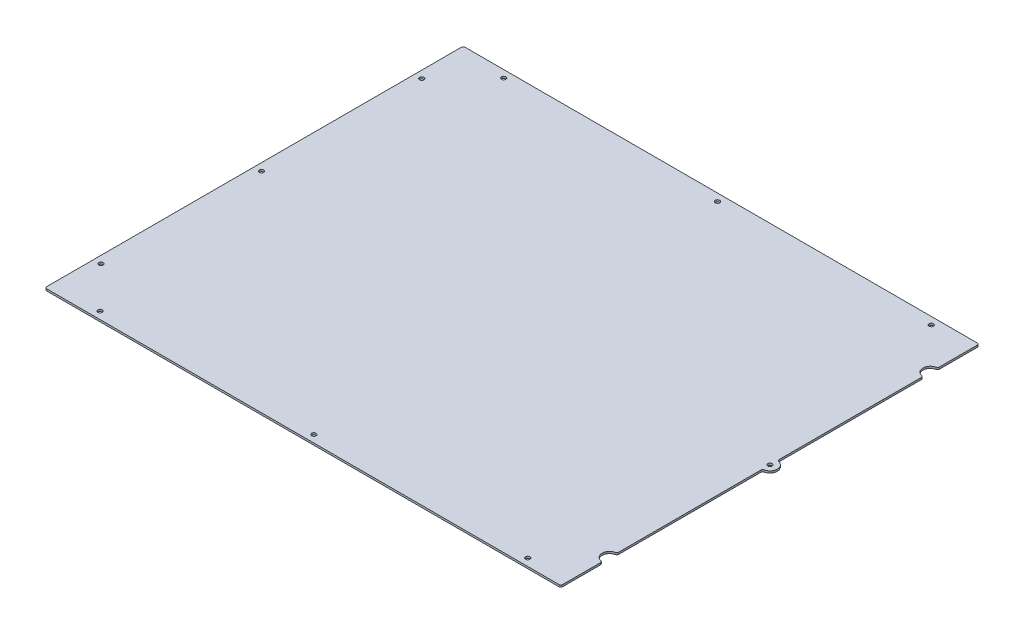
ISO-10303-21;
HEADER;
FILE_DESCRIPTION(('STEP AP214'),'2;1');
FILE_NAME('part.step','',(''),(''),'','','');
FILE_SCHEMA(('AUTOMOTIVE_DESIGN { 1 0 10303 214 1 1 1 1 }'));
ENDSEC;
DATA;
#1=APPLICATION_CONTEXT('core data for automotive mechanical design processes');
#2=APPLICATION_PROTOCOL_DEFINITION('international standard','automotive_design',2000,#1);
#3=PRODUCT_CONTEXT('',#1,'mechanical');
#4=PRODUCT('Part','Part','',(#3));
#5=PRODUCT_RELATED_PRODUCT_CATEGORY('part','',(#4));
#6=PRODUCT_DEFINITION_FORMATION('','',#4);
#7=PRODUCT_DEFINITION_CONTEXT('part definition',#1,'design');
#8=PRODUCT_DEFINITION('design','',#6,#7);
#9=PRODUCT_DEFINITION_SHAPE('','',#8);
#10=(LENGTH_UNIT() NAMED_UNIT(*) SI_UNIT(.MILLI.,.METRE.));
#11=(NAMED_UNIT(*) PLANE_ANGLE_UNIT() SI_UNIT($,.RADIAN.));
#12=(NAMED_UNIT(*) SI_UNIT($,.STERADIAN.) SOLID_ANGLE_UNIT());
#13=UNCERTAINTY_MEASURE_WITH_UNIT(LENGTH_MEASURE(1.E-05),#10,'distance_accuracy_value','');
#14=(GEOMETRIC_REPRESENTATION_CONTEXT(3) GLOBAL_UNCERTAINTY_ASSIGNED_CONTEXT((#13)) GLOBAL_UNIT_ASSIGNED_CONTEXT((#10,
#11,#12)) REPRESENTATION_CONTEXT('',''));
#15=CARTESIAN_POINT('',(0.,0.,0.));
#16=DIRECTION('',(0.,0.,1.));
#17=DIRECTION('',(1.,0.,0.));
#18=AXIS2_PLACEMENT_3D('',#15,#16,#17);
#19=CARTESIAN_POINT('',(-341.884,2.54,273.304));
#20=DIRECTION('',(1.,0.,0.));
#21=DIRECTION('',(0.,0.,-1.));
#22=AXIS2_PLACEMENT_3D('',#19,#20,#21);
#23=PLANE('',#22);
#24=DIRECTION('',(0.,0.,1.));
#25=VECTOR('',#24,1.);
#26=CARTESIAN_POINT('',(-341.884,2.54,273.304));
#27=LINE('',#26,#25);
#28=CARTESIAN_POINT('',(-341.884,2.54,-270.764));
#29=VERTEX_POINT('',#28);
#30=CARTESIAN_POINT('',(-341.884,2.54,270.764));
#31=VERTEX_POINT('',#30);
#32=EDGE_CURVE('E192',#29,#31,#27,.T.);
#33=ORIENTED_EDGE('',*,*,#32,.F.);
#34=DIRECTION('',(0.,-1.,0.));
#35=VECTOR('',#34,1.);
#36=CARTESIAN_POINT('',(-341.884,2.54,-270.764));
#37=LINE('',#36,#35);
#38=CARTESIAN_POINT('',(-341.884,0.,-270.764));
#39=VERTEX_POINT('',#38);
#40=EDGE_CURVE('E177',#29,#39,#37,.T.);
#41=ORIENTED_EDGE('',*,*,#40,.T.);
#42=DIRECTION('',(0.,0.,1.));
#43=VECTOR('',#42,1.);
#44=CARTESIAN_POINT('',(-341.884,0.,273.304));
#45=LINE('',#44,#43);
#46=CARTESIAN_POINT('',(-341.884,0.,270.764));
#47=VERTEX_POINT('',#46);
#48=EDGE_CURVE('E189',#39,#47,#45,.T.);
#49=ORIENTED_EDGE('',*,*,#48,.T.);
#50=DIRECTION('',(0.,-1.,0.));
#51=VECTOR('',#50,1.);
#52=CARTESIAN_POINT('',(-341.884,2.54,270.764));
#53=LINE('',#52,#51);
#54=EDGE_CURVE('E194',#47,#31,#53,.F.);
#55=ORIENTED_EDGE('',*,*,#54,.T.);
#56=EDGE_LOOP('',(#33,#41,#49,#55));
#57=FACE_BOUND('',#56,.T.);
#58=ADVANCED_FACE('F35',(#57),#23,.F.);
#59=CARTESIAN_POINT('',(-341.884,2.54,273.304));
#60=DIRECTION('',(0.,0.,-1.));
#61=DIRECTION('',(-1.,0.,0.));
#62=AXIS2_PLACEMENT_3D('',#59,#60,#61);
#63=PLANE('',#62);
#64=DIRECTION('',(1.,0.,0.));
#65=VECTOR('',#64,1.);
#66=CARTESIAN_POINT('',(-341.884,2.54,273.304));
#67=LINE('',#66,#65);
#68=CARTESIAN_POINT('',(-339.344,2.54,273.304));
#69=VERTEX_POINT('',#68);
#70=CARTESIAN_POINT('',(329.692,2.54,273.304));
#71=VERTEX_POINT('',#70);
#72=EDGE_CURVE('E409',#69,#71,#67,.T.);
#73=ORIENTED_EDGE('',*,*,#72,.F.);
#74=DIRECTION('',(0.,-1.,0.));
#75=VECTOR('',#74,1.);
#76=CARTESIAN_POINT('',(-339.344,2.54,273.304));
#77=LINE('',#76,#75);
#78=CARTESIAN_POINT('',(-339.344,0.,273.304));
#79=VERTEX_POINT('',#78);
#80=EDGE_CURVE('E265',#69,#79,#77,.T.);
#81=ORIENTED_EDGE('',*,*,#80,.T.);
#82=DIRECTION('',(1.,0.,0.));
#83=VECTOR('',#82,1.);
#84=CARTESIAN_POINT('',(-341.884,0.,273.304));
#85=LINE('',#84,#83);
#86=CARTESIAN_POINT('',(329.692,0.,273.304));
#87=VERTEX_POINT('',#86);
#88=EDGE_CURVE('E198',#79,#87,#85,.T.);
#89=ORIENTED_EDGE('',*,*,#88,.T.);
#90=DIRECTION('',(0.,-1.,0.));
#91=VECTOR('',#90,1.);
#92=CARTESIAN_POINT('',(329.692,2.54,273.304));
#93=LINE('',#92,#91);
#94=EDGE_CURVE('E263',#87,#71,#93,.F.);
#95=ORIENTED_EDGE('',*,*,#94,.T.);
#96=EDGE_LOOP('',(#73,#81,#89,#95));
#97=FACE_BOUND('',#96,.T.);
#98=ADVANCED_FACE('F362',(#97),#63,.F.);
#99=CARTESIAN_POINT('',(332.232,2.54,219.202));
#100=DIRECTION('',(-1.,0.,0.));
#101=DIRECTION('',(0.,0.,1.));
#102=AXIS2_PLACEMENT_3D('',#99,#100,#101);
#103=PLANE('',#102);
#104=DIRECTION('',(0.,0.,-1.));
#105=VECTOR('',#104,1.);
#106=CARTESIAN_POINT('',(332.232,2.54,219.202));
#107=LINE('',#106,#105);
#108=CARTESIAN_POINT('',(332.232,2.54,270.764));
#109=VERTEX_POINT('',#108);
#110=CARTESIAN_POINT('',(332.232,2.54,221.474481707814));
#111=VERTEX_POINT('',#110);
#112=EDGE_CURVE('E404',#109,#111,#107,.T.);
#113=ORIENTED_EDGE('',*,*,#112,.F.);
#114=DIRECTION('',(0.,-1.,0.));
#115=VECTOR('',#114,1.);
#116=CARTESIAN_POINT('',(332.232,2.54,270.764));
#117=LINE('',#116,#115);
#118=CARTESIAN_POINT('',(332.232,0.,270.764));
#119=VERTEX_POINT('',#118);
#120=EDGE_CURVE('E270',#109,#119,#117,.T.);
#121=ORIENTED_EDGE('',*,*,#120,.T.);
#122=DIRECTION('',(0.,0.,-1.));
#123=VECTOR('',#122,1.);
#124=CARTESIAN_POINT('',(332.232,0.,219.202));
#125=LINE('',#124,#123);
#126=CARTESIAN_POINT('',(332.232,0.,221.474481707814));
#127=VERTEX_POINT('',#126);
#128=EDGE_CURVE('E202',#119,#127,#125,.T.);
#129=ORIENTED_EDGE('',*,*,#128,.T.);
#130=DIRECTION('',(0.,-1.,0.));
#131=VECTOR('',#130,1.);
#132=CARTESIAN_POINT('',(332.232,2.54,221.474481707814));
#133=LINE('',#132,#131);
#134=EDGE_CURVE('E268',#127,#111,#133,.F.);
#135=ORIENTED_EDGE('',*,*,#134,.T.);
#136=EDGE_LOOP('',(#113,#121,#129,#135));
#137=FACE_BOUND('',#136,.T.);
#138=ADVANCED_FACE('F367',(#137),#103,.F.);
#139=CARTESIAN_POINT('',(332.232,2.54,209.55));
#140=DIRECTION('',(0.,-1.,0.));
#141=DIRECTION('',(0.,0.,-1.));
#142=AXIS2_PLACEMENT_3D('',#139,#140,#141);
#143=CYLINDRICAL_SURFACE('',#142,9.65199999999997);
#144=CARTESIAN_POINT('',(332.232,2.54,209.55));
#145=DIRECTION('',(0.,-1.,0.));
#146=DIRECTION('',(0.,0.,1.));
#147=AXIS2_PLACEMENT_3D('',#144,#145,#146);
#148=CIRCLE('',#147,9.65199999999997);
#149=CARTESIAN_POINT('',(330.221166666667,2.54,218.990214685353));
#150=VERTEX_POINT('',#149);
#151=CARTESIAN_POINT('',(330.221166666667,2.54,200.109785314647));
#152=VERTEX_POINT('',#151);
#153=EDGE_CURVE('E403',#150,#152,#148,.T.);
#154=ORIENTED_EDGE('',*,*,#153,.F.);
#155=DIRECTION('',(0.,-1.,0.));
#156=VECTOR('',#155,1.);
#157=CARTESIAN_POINT('',(330.221166666667,2.54,218.990214685353));
#158=LINE('',#157,#156);
#159=CARTESIAN_POINT('',(330.221166666667,0.,218.990214685353));
#160=VERTEX_POINT('',#159);
#161=EDGE_CURVE('E275',#150,#160,#158,.T.);
#162=ORIENTED_EDGE('',*,*,#161,.T.);
#163=CARTESIAN_POINT('',(332.232,0.,209.55));
#164=DIRECTION('',(0.,-1.,0.));
#165=DIRECTION('',(0.,0.,1.));
#166=AXIS2_PLACEMENT_3D('',#163,#164,#165);
#167=CIRCLE('',#166,9.65199999999997);
#168=CARTESIAN_POINT('',(330.221166666667,0.,200.109785314647));
#169=VERTEX_POINT('',#168);
#170=EDGE_CURVE('E213',#160,#169,#167,.T.);
#171=ORIENTED_EDGE('',*,*,#170,.T.);
#172=DIRECTION('',(0.,-1.,0.));
#173=VECTOR('',#172,1.);
#174=CARTESIAN_POINT('',(330.221166666667,2.54,200.109785314647));
#175=LINE('',#174,#173);
#176=EDGE_CURVE('E273',#169,#152,#175,.F.);
#177=ORIENTED_EDGE('',*,*,#176,.T.);
#178=EDGE_LOOP('',(#154,#162,#171,#177));
#179=FACE_BOUND('',#178,.T.);
#180=ADVANCED_FACE('F519',(#179),#143,.F.);
#181=CARTESIAN_POINT('',(332.232,2.54,9.65199999999998));
#182=DIRECTION('',(-1.,0.,0.));
#183=DIRECTION('',(0.,0.,1.));
#184=AXIS2_PLACEMENT_3D('',#181,#182,#183);
#185=PLANE('',#184);
#186=DIRECTION('',(0.,0.,-1.));
#187=VECTOR('',#186,1.);
#188=CARTESIAN_POINT('',(332.232,2.54,9.65199999999998));
#189=LINE('',#188,#187);
#190=CARTESIAN_POINT('',(332.232,2.54,197.625518292186));
#191=VERTEX_POINT('',#190);
#192=CARTESIAN_POINT('',(332.232,2.54,11.9244817078144));
#193=VERTEX_POINT('',#192);
#194=EDGE_CURVE('E331',#191,#193,#189,.T.);
#195=ORIENTED_EDGE('',*,*,#194,.F.);
#196=DIRECTION('',(0.,-1.,0.));
#197=VECTOR('',#196,1.);
#198=CARTESIAN_POINT('',(332.232,2.54,197.625518292186));
#199=LINE('',#198,#197);
#200=CARTESIAN_POINT('',(332.232,0.,197.625518292186));
#201=VERTEX_POINT('',#200);
#202=EDGE_CURVE('E280',#191,#201,#199,.T.);
#203=ORIENTED_EDGE('',*,*,#202,.T.);
#204=DIRECTION('',(0.,0.,-1.));
#205=VECTOR('',#204,1.);
#206=CARTESIAN_POINT('',(332.232,0.,9.65199999999998));
#207=LINE('',#206,#205);
#208=CARTESIAN_POINT('',(332.232,0.,11.9244817078144));
#209=VERTEX_POINT('',#208);
#210=EDGE_CURVE('E216',#201,#209,#207,.T.);
#211=ORIENTED_EDGE('',*,*,#210,.T.);
#212=DIRECTION('',(0.,1.,0.));
#213=VECTOR('',#212,1.);
#214=CARTESIAN_POINT('',(332.232,2.54,11.9244817078144));
#215=LINE('',#214,#213);
#216=EDGE_CURVE('E278',#209,#193,#215,.T.);
#217=ORIENTED_EDGE('',*,*,#216,.T.);
#218=EDGE_LOOP('',(#195,#203,#211,#217));
#219=FACE_BOUND('',#218,.T.);
#220=ADVANCED_FACE('F516',(#219),#185,.F.);
#221=CARTESIAN_POINT('',(332.232,2.54,0.));
#222=DIRECTION('',(0.,-1.,0.));
#223=DIRECTION('',(0.,0.,-1.));
#224=AXIS2_PLACEMENT_3D('',#221,#222,#223);
#225=CYLINDRICAL_SURFACE('',#224,9.65199999999998);
#226=CARTESIAN_POINT('',(332.232,2.54,0.));
#227=DIRECTION('',(0.,1.,0.));
#228=DIRECTION('',(0.,0.,1.));
#229=AXIS2_PLACEMENT_3D('',#226,#227,#228);
#230=CIRCLE('',#229,9.65199999999998);
#231=CARTESIAN_POINT('',(334.242833333333,2.54,9.44021468535305));
#232=VERTEX_POINT('',#231);
#233=CARTESIAN_POINT('',(334.242833333333,2.54,-9.44021468535305));
#234=VERTEX_POINT('',#233);
#235=EDGE_CURVE('E323',#232,#234,#230,.T.);
#236=ORIENTED_EDGE('',*,*,#235,.F.);
#237=DIRECTION('',(0.,-1.,0.));
#238=VECTOR('',#237,1.);
#239=CARTESIAN_POINT('',(334.242833333333,2.54,9.44021468535305));
#240=LINE('',#239,#238);
#241=CARTESIAN_POINT('',(334.242833333333,0.,9.44021468535305));
#242=VERTEX_POINT('',#241);
#243=EDGE_CURVE('E285',#232,#242,#240,.T.);
#244=ORIENTED_EDGE('',*,*,#243,.T.);
#245=CARTESIAN_POINT('',(332.232,0.,0.));
#246=DIRECTION('',(0.,1.,0.));
#247=DIRECTION('',(0.,0.,1.));
#248=AXIS2_PLACEMENT_3D('',#245,#246,#247);
#249=CIRCLE('',#248,9.65199999999998);
#250=CARTESIAN_POINT('',(334.242833333333,0.,-9.44021468535305));
#251=VERTEX_POINT('',#250);
#252=EDGE_CURVE('E219',#242,#251,#249,.T.);
#253=ORIENTED_EDGE('',*,*,#252,.T.);
#254=DIRECTION('',(0.,-1.,0.));
#255=VECTOR('',#254,1.);
#256=CARTESIAN_POINT('',(334.242833333333,2.54,-9.44021468535305));
#257=LINE('',#256,#255);
#258=EDGE_CURVE('E283',#251,#234,#257,.F.);
#259=ORIENTED_EDGE('',*,*,#258,.T.);
#260=EDGE_LOOP('',(#236,#244,#253,#259));
#261=FACE_BOUND('',#260,.T.);
#262=ADVANCED_FACE('F312',(#261),#225,.T.);
#263=CARTESIAN_POINT('',(332.232,2.54,-199.898));
#264=DIRECTION('',(-1.,0.,0.));
#265=DIRECTION('',(0.,0.,1.));
#266=AXIS2_PLACEMENT_3D('',#263,#264,#265);
#267=PLANE('',#266);
#268=DIRECTION('',(0.,0.,-1.));
#269=VECTOR('',#268,1.);
#270=CARTESIAN_POINT('',(332.232,2.54,-199.898));
#271=LINE('',#270,#269);
#272=CARTESIAN_POINT('',(332.232,2.54,-11.9244817078144));
#273=VERTEX_POINT('',#272);
#274=CARTESIAN_POINT('',(332.232,2.54,-197.625518292186));
#275=VERTEX_POINT('',#274);
#276=EDGE_CURVE('E321',#273,#275,#271,.T.);
#277=ORIENTED_EDGE('',*,*,#276,.F.);
#278=DIRECTION('',(0.,1.,0.));
#279=VECTOR('',#278,1.);
#280=CARTESIAN_POINT('',(332.232,0.,-11.9244817078144));
#281=LINE('',#280,#279);
#282=CARTESIAN_POINT('',(332.232,0.,-11.9244817078144));
#283=VERTEX_POINT('',#282);
#284=EDGE_CURVE('E290',#273,#283,#281,.F.);
#285=ORIENTED_EDGE('',*,*,#284,.T.);
#286=DIRECTION('',(0.,0.,-1.));
#287=VECTOR('',#286,1.);
#288=CARTESIAN_POINT('',(332.232,0.,-199.898));
#289=LINE('',#288,#287);
#290=CARTESIAN_POINT('',(332.232,0.,-197.625518292186));
#291=VERTEX_POINT('',#290);
#292=EDGE_CURVE('E222',#283,#291,#289,.T.);
#293=ORIENTED_EDGE('',*,*,#292,.T.);
#294=DIRECTION('',(0.,-1.,0.));
#295=VECTOR('',#294,1.);
#296=CARTESIAN_POINT('',(332.232,2.54,-197.625518292186));
#297=LINE('',#296,#295);
#298=EDGE_CURVE('E288',#291,#275,#297,.F.);
#299=ORIENTED_EDGE('',*,*,#298,.T.);
#300=EDGE_LOOP('',(#277,#285,#293,#299));
#301=FACE_BOUND('',#300,.T.);
#302=ADVANCED_FACE('F325',(#301),#267,.F.);
#303=CARTESIAN_POINT('',(332.232,2.54,-209.55));
#304=DIRECTION('',(0.,-1.,0.));
#305=DIRECTION('',(0.,0.,-1.));
#306=AXIS2_PLACEMENT_3D('',#303,#304,#305);
#307=CYLINDRICAL_SURFACE('',#306,9.65199999999997);
#308=CARTESIAN_POINT('',(332.232,2.54,-209.55));
#309=DIRECTION('',(0.,-1.,0.));
#310=DIRECTION('',(0.,0.,1.));
#311=AXIS2_PLACEMENT_3D('',#308,#309,#310);
#312=CIRCLE('',#311,9.65199999999997);
#313=CARTESIAN_POINT('',(330.221166666667,2.54,-200.109785314647));
#314=VERTEX_POINT('',#313);
#315=CARTESIAN_POINT('',(330.221166666667,2.54,-218.990214685353));
#316=VERTEX_POINT('',#315);
#317=EDGE_CURVE('E327',#314,#316,#312,.T.);
#318=ORIENTED_EDGE('',*,*,#317,.F.);
#319=DIRECTION('',(0.,-1.,0.));
#320=VECTOR('',#319,1.);
#321=CARTESIAN_POINT('',(330.221166666667,2.54,-200.109785314647));
#322=LINE('',#321,#320);
#323=CARTESIAN_POINT('',(330.221166666667,0.,-200.109785314647));
#324=VERTEX_POINT('',#323);
#325=EDGE_CURVE('E295',#314,#324,#322,.T.);
#326=ORIENTED_EDGE('',*,*,#325,.T.);
#327=CARTESIAN_POINT('',(332.232,0.,-209.55));
#328=DIRECTION('',(0.,-1.,0.));
#329=DIRECTION('',(0.,0.,1.));
#330=AXIS2_PLACEMENT_3D('',#327,#328,#329);
#331=CIRCLE('',#330,9.65199999999997);
#332=CARTESIAN_POINT('',(330.221166666667,0.,-218.990214685353));
#333=VERTEX_POINT('',#332);
#334=EDGE_CURVE('E225',#324,#333,#331,.T.);
#335=ORIENTED_EDGE('',*,*,#334,.T.);
#336=DIRECTION('',(0.,-1.,0.));
#337=VECTOR('',#336,1.);
#338=CARTESIAN_POINT('',(330.221166666667,2.54,-218.990214685353));
#339=LINE('',#338,#337);
#340=EDGE_CURVE('E293',#333,#316,#339,.F.);
#341=ORIENTED_EDGE('',*,*,#340,.T.);
#342=EDGE_LOOP('',(#318,#326,#335,#341));
#343=FACE_BOUND('',#342,.T.);
#344=ADVANCED_FACE('F349',(#343),#307,.F.);
#345=CARTESIAN_POINT('',(332.232,2.54,-273.304));
#346=DIRECTION('',(-1.,0.,0.));
#347=DIRECTION('',(0.,0.,1.));
#348=AXIS2_PLACEMENT_3D('',#345,#346,#347);
#349=PLANE('',#348);
#350=DIRECTION('',(0.,0.,-1.));
#351=VECTOR('',#350,1.);
#352=CARTESIAN_POINT('',(332.232,2.54,-273.304));
#353=LINE('',#352,#351);
#354=CARTESIAN_POINT('',(332.232,2.54,-221.474481707814));
#355=VERTEX_POINT('',#354);
#356=CARTESIAN_POINT('',(332.232,2.54,-270.764));
#357=VERTEX_POINT('',#356);
#358=EDGE_CURVE('E329',#355,#357,#353,.T.);
#359=ORIENTED_EDGE('',*,*,#358,.F.);
#360=DIRECTION('',(0.,-1.,0.));
#361=VECTOR('',#360,1.);
#362=CARTESIAN_POINT('',(332.232,2.54,-221.474481707814));
#363=LINE('',#362,#361);
#364=CARTESIAN_POINT('',(332.232,0.,-221.474481707814));
#365=VERTEX_POINT('',#364);
#366=EDGE_CURVE('E299',#355,#365,#363,.T.);
#367=ORIENTED_EDGE('',*,*,#366,.T.);
#368=DIRECTION('',(0.,0.,-1.));
#369=VECTOR('',#368,1.);
#370=CARTESIAN_POINT('',(332.232,0.,-273.304));
#371=LINE('',#370,#369);
#372=CARTESIAN_POINT('',(332.232,0.,-270.764));
#373=VERTEX_POINT('',#372);
#374=EDGE_CURVE('E228',#365,#373,#371,.T.);
#375=ORIENTED_EDGE('',*,*,#374,.T.);
#376=DIRECTION('',(0.,-1.,0.));
#377=VECTOR('',#376,1.);
#378=CARTESIAN_POINT('',(332.232,2.54,-270.764));
#379=LINE('',#378,#377);
#380=EDGE_CURVE('E50',#373,#357,#379,.F.);
#381=ORIENTED_EDGE('',*,*,#380,.T.);
#382=EDGE_LOOP('',(#359,#367,#375,#381));
#383=FACE_BOUND('',#382,.T.);
#384=ADVANCED_FACE('F341',(#383),#349,.F.);
#385=CARTESIAN_POINT('',(-341.884,2.54,-273.304));
#386=DIRECTION('',(0.,0.,1.));
#387=DIRECTION('',(1.,0.,0.));
#388=AXIS2_PLACEMENT_3D('',#385,#386,#387);
#389=PLANE('',#388);
#390=DIRECTION('',(-1.,0.,0.));
#391=VECTOR('',#390,1.);
#392=CARTESIAN_POINT('',(-341.884,0.,-273.304));
#393=LINE('',#392,#391);
#394=CARTESIAN_POINT('',(329.692,0.,-273.304));
#395=VERTEX_POINT('',#394);
#396=CARTESIAN_POINT('',(-339.344,0.,-273.304));
#397=VERTEX_POINT('',#396);
#398=EDGE_CURVE('E230',#395,#397,#393,.T.);
#399=ORIENTED_EDGE('',*,*,#398,.T.);
#400=DIRECTION('',(0.,-1.,0.));
#401=VECTOR('',#400,1.);
#402=CARTESIAN_POINT('',(-339.344,2.54,-273.304));
#403=LINE('',#402,#401);
#404=CARTESIAN_POINT('',(-339.344,2.54,-273.304));
#405=VERTEX_POINT('',#404);
#406=EDGE_CURVE('E178',#397,#405,#403,.F.);
#407=ORIENTED_EDGE('',*,*,#406,.T.);
#408=DIRECTION('',(-1.,0.,0.));
#409=VECTOR('',#408,1.);
#410=CARTESIAN_POINT('',(-341.884,2.54,-273.304));
#411=LINE('',#410,#409);
#412=CARTESIAN_POINT('',(329.692,2.54,-273.304));
#413=VERTEX_POINT('',#412);
#414=EDGE_CURVE('E208',#413,#405,#411,.T.);
#415=ORIENTED_EDGE('',*,*,#414,.F.);
#416=DIRECTION('',(0.,-1.,0.));
#417=VECTOR('',#416,1.);
#418=CARTESIAN_POINT('',(329.692,2.54,-273.304));
#419=LINE('',#418,#417);
#420=EDGE_CURVE('E183',#413,#395,#419,.T.);
#421=ORIENTED_EDGE('',*,*,#420,.T.);
#422=EDGE_LOOP('',(#399,#407,#415,#421));
#423=FACE_BOUND('',#422,.T.);
#424=ADVANCED_FACE('F338',(#423),#389,.F.);
#425=CARTESIAN_POINT('',(332.232,2.54,-209.55));
#426=DIRECTION('',(0.,1.,0.));
#427=DIRECTION('',(0.,0.,1.));
#428=AXIS2_PLACEMENT_3D('',#425,#426,#427);
#429=PLANE('',#428);
#430=CARTESIAN_POINT('',(-279.4,2.54,-263.652));
#431=DIRECTION('',(0.,1.,0.));
#432=DIRECTION('',(0.,0.,1.));
#433=AXIS2_PLACEMENT_3D('',#430,#431,#432);
#434=CIRCLE('',#433,2.8956);
#435=CARTESIAN_POINT('',(-279.4,2.54,-260.7564));
#436=VERTEX_POINT('',#435);
#437=EDGE_CURVE('E466',#436,#436,#434,.T.);
#438=ORIENTED_EDGE('',*,*,#437,.F.);
#439=EDGE_LOOP('',(#438));
#440=FACE_BOUND('',#439,.T.);
#441=CARTESIAN_POINT('',(-332.232,2.54,-209.55));
#442=DIRECTION('',(0.,1.,0.));
#443=DIRECTION('',(0.,0.,1.));
#444=AXIS2_PLACEMENT_3D('',#441,#442,#443);
#445=CIRCLE('',#444,2.8956);
#446=CARTESIAN_POINT('',(-332.232,2.54,-206.6544));
#447=VERTEX_POINT('',#446);
#448=EDGE_CURVE('E460',#447,#447,#445,.T.);
#449=ORIENTED_EDGE('',*,*,#448,.F.);
#450=EDGE_LOOP('',(#449));
#451=FACE_BOUND('',#450,.T.);
#452=CARTESIAN_POINT('',(3.88578058618805E-13,2.54,-263.652));
#453=DIRECTION('',(0.,1.,0.));
#454=DIRECTION('',(0.,0.,1.));
#455=AXIS2_PLACEMENT_3D('',#452,#453,#454);
#456=CIRCLE('',#455,2.89559999999999);
#457=CARTESIAN_POINT('',(3.88578058618805E-13,2.54,-260.7564));
#458=VERTEX_POINT('',#457);
#459=EDGE_CURVE('E454',#458,#458,#456,.T.);
#460=ORIENTED_EDGE('',*,*,#459,.F.);
#461=EDGE_LOOP('',(#460));
#462=FACE_BOUND('',#461,.T.);
#463=CARTESIAN_POINT('',(279.4,2.54,-263.652));
#464=DIRECTION('',(0.,1.,0.));
#465=DIRECTION('',(0.,0.,1.));
#466=AXIS2_PLACEMENT_3D('',#463,#464,#465);
#467=CIRCLE('',#466,2.8956);
#468=CARTESIAN_POINT('',(279.4,2.54,-260.7564));
#469=VERTEX_POINT('',#468);
#470=EDGE_CURVE('E448',#469,#469,#467,.T.);
#471=ORIENTED_EDGE('',*,*,#470,.F.);
#472=EDGE_LOOP('',(#471));
#473=FACE_BOUND('',#472,.T.);
#474=CARTESIAN_POINT('',(279.400000000001,2.54,263.652));
#475=DIRECTION('',(0.,1.,0.));
#476=DIRECTION('',(0.,0.,1.));
#477=AXIS2_PLACEMENT_3D('',#474,#475,#476);
#478=CIRCLE('',#477,2.8956);
#479=CARTESIAN_POINT('',(279.400000000001,2.54,266.5476));
#480=VERTEX_POINT('',#479);
#481=EDGE_CURVE('E442',#480,#480,#478,.T.);
#482=ORIENTED_EDGE('',*,*,#481,.F.);
#483=EDGE_LOOP('',(#482));
#484=FACE_BOUND('',#483,.T.);
#485=CARTESIAN_POINT('',(6.10622663543836E-13,2.54,263.652));
#486=DIRECTION('',(0.,1.,0.));
#487=DIRECTION('',(0.,0.,1.));
#488=AXIS2_PLACEMENT_3D('',#485,#486,#487);
#489=CIRCLE('',#488,2.89559999999999);
#490=CARTESIAN_POINT('',(6.10622663543836E-13,2.54,266.5476));
#491=VERTEX_POINT('',#490);
#492=EDGE_CURVE('E436',#491,#491,#489,.T.);
#493=ORIENTED_EDGE('',*,*,#492,.F.);
#494=EDGE_LOOP('',(#493));
#495=FACE_BOUND('',#494,.T.);
#496=CARTESIAN_POINT('',(-279.399999999999,2.54,263.652));
#497=DIRECTION('',(0.,1.,0.));
#498=DIRECTION('',(0.,0.,1.));
#499=AXIS2_PLACEMENT_3D('',#496,#497,#498);
#500=CIRCLE('',#499,2.8956);
#501=CARTESIAN_POINT('',(-279.399999999999,2.54,266.5476));
#502=VERTEX_POINT('',#501);
#503=EDGE_CURVE('E430',#502,#502,#500,.T.);
#504=ORIENTED_EDGE('',*,*,#503,.F.);
#505=EDGE_LOOP('',(#504));
#506=FACE_BOUND('',#505,.T.);
#507=CARTESIAN_POINT('',(-332.232,2.54,209.55));
#508=DIRECTION('',(0.,1.,0.));
#509=DIRECTION('',(0.,0.,1.));
#510=AXIS2_PLACEMENT_3D('',#507,#508,#509);
#511=CIRCLE('',#510,2.8956);
#512=CARTESIAN_POINT('',(-332.232,2.54,212.4456));
#513=VERTEX_POINT('',#512);
#514=EDGE_CURVE('E424',#513,#513,#511,.T.);
#515=ORIENTED_EDGE('',*,*,#514,.F.);
#516=EDGE_LOOP('',(#515));
#517=FACE_BOUND('',#516,.T.);
#518=CARTESIAN_POINT('',(-332.232,2.54,-3.33066907387547E-13));
#519=DIRECTION('',(0.,1.,0.));
#520=DIRECTION('',(0.,0.,1.));
#521=AXIS2_PLACEMENT_3D('',#518,#519,#520);
#522=CIRCLE('',#521,2.8956);
#523=CARTESIAN_POINT('',(-332.232,2.54,2.89559999999967));
#524=VERTEX_POINT('',#523);
#525=EDGE_CURVE('E418',#524,#524,#522,.T.);
#526=ORIENTED_EDGE('',*,*,#525,.F.);
#527=EDGE_LOOP('',(#526));
#528=FACE_BOUND('',#527,.T.);
#529=CARTESIAN_POINT('',(332.232,2.54,0.));
#530=DIRECTION('',(0.,1.,0.));
#531=DIRECTION('',(0.,0.,1.));
#532=AXIS2_PLACEMENT_3D('',#529,#530,#531);
#533=CIRCLE('',#532,2.8956);
#534=CARTESIAN_POINT('',(332.232,2.54,2.8956));
#535=VERTEX_POINT('',#534);
#536=EDGE_CURVE('E205',#535,#535,#533,.T.);
#537=ORIENTED_EDGE('',*,*,#536,.F.);
#538=EDGE_LOOP('',(#537));
#539=FACE_BOUND('',#538,.T.);
#540=ORIENTED_EDGE('',*,*,#414,.T.);
#541=CARTESIAN_POINT('',(-339.344,2.54,-270.764));
#542=DIRECTION('',(0.,1.,0.));
#543=DIRECTION('',(0.,0.,1.));
#544=AXIS2_PLACEMENT_3D('',#541,#542,#543);
#545=CIRCLE('',#544,2.54);
#546=EDGE_CURVE('E261',#405,#29,#545,.T.);
#547=ORIENTED_EDGE('',*,*,#546,.T.);
#548=ORIENTED_EDGE('',*,*,#32,.T.);
#549=CARTESIAN_POINT('',(-339.344,2.54,270.764));
#550=DIRECTION('',(0.,1.,0.));
#551=DIRECTION('',(0.,0.,1.));
#552=AXIS2_PLACEMENT_3D('',#549,#550,#551);
#553=CIRCLE('',#552,2.54);
#554=EDGE_CURVE('E259',#31,#69,#553,.T.);
#555=ORIENTED_EDGE('',*,*,#554,.T.);
#556=ORIENTED_EDGE('',*,*,#72,.T.);
#557=CARTESIAN_POINT('',(329.692,2.54,270.764));
#558=DIRECTION('',(0.,1.,0.));
#559=DIRECTION('',(0.,0.,1.));
#560=AXIS2_PLACEMENT_3D('',#557,#558,#559);
#561=CIRCLE('',#560,2.54);
#562=EDGE_CURVE('E257',#71,#109,#561,.T.);
#563=ORIENTED_EDGE('',*,*,#562,.T.);
#564=ORIENTED_EDGE('',*,*,#112,.T.);
#565=CARTESIAN_POINT('',(329.692,2.54,221.474481707814));
#566=DIRECTION('',(0.,1.,0.));
#567=DIRECTION('',(0.,0.,1.));
#568=AXIS2_PLACEMENT_3D('',#565,#566,#567);
#569=CIRCLE('',#568,2.54);
#570=EDGE_CURVE('E255',#111,#150,#569,.T.);
#571=ORIENTED_EDGE('',*,*,#570,.T.);
#572=ORIENTED_EDGE('',*,*,#153,.T.);
#573=CARTESIAN_POINT('',(329.692,2.54,197.625518292186));
#574=DIRECTION('',(0.,1.,0.));
#575=DIRECTION('',(0.,0.,1.));
#576=AXIS2_PLACEMENT_3D('',#573,#574,#575);
#577=CIRCLE('',#576,2.54);
#578=EDGE_CURVE('E253',#152,#191,#577,.T.);
#579=ORIENTED_EDGE('',*,*,#578,.T.);
#580=ORIENTED_EDGE('',*,*,#194,.T.);
#581=CARTESIAN_POINT('',(334.772,2.54,11.9244817078144));
#582=DIRECTION('',(0.,1.,0.));
#583=DIRECTION('',(0.,0.,1.));
#584=AXIS2_PLACEMENT_3D('',#581,#582,#583);
#585=CIRCLE('',#584,2.54);
#586=EDGE_CURVE('E304',#193,#232,#585,.F.);
#587=ORIENTED_EDGE('',*,*,#586,.T.);
#588=ORIENTED_EDGE('',*,*,#235,.T.);
#589=CARTESIAN_POINT('',(334.772,2.54,-11.9244817078144));
#590=DIRECTION('',(0.,1.,0.));
#591=DIRECTION('',(0.,0.,1.));
#592=AXIS2_PLACEMENT_3D('',#589,#590,#591);
#593=CIRCLE('',#592,2.54);
#594=EDGE_CURVE('E11',#234,#273,#593,.F.);
#595=ORIENTED_EDGE('',*,*,#594,.T.);
#596=ORIENTED_EDGE('',*,*,#276,.T.);
#597=CARTESIAN_POINT('',(329.692,2.54,-197.625518292186));
#598=DIRECTION('',(0.,1.,0.));
#599=DIRECTION('',(0.,0.,1.));
#600=AXIS2_PLACEMENT_3D('',#597,#598,#599);
#601=CIRCLE('',#600,2.54);
#602=EDGE_CURVE('E251',#275,#314,#601,.T.);
#603=ORIENTED_EDGE('',*,*,#602,.T.);
#604=ORIENTED_EDGE('',*,*,#317,.T.);
#605=CARTESIAN_POINT('',(329.692,2.54,-221.474481707814));
#606=DIRECTION('',(0.,1.,0.));
#607=DIRECTION('',(0.,0.,1.));
#608=AXIS2_PLACEMENT_3D('',#605,#606,#607);
#609=CIRCLE('',#608,2.54);
#610=EDGE_CURVE('E57',#316,#355,#609,.T.);
#611=ORIENTED_EDGE('',*,*,#610,.T.);
#612=ORIENTED_EDGE('',*,*,#358,.T.);
#613=CARTESIAN_POINT('',(329.692,2.54,-270.764));
#614=DIRECTION('',(0.,1.,0.));
#615=DIRECTION('',(0.,0.,1.));
#616=AXIS2_PLACEMENT_3D('',#613,#614,#615);
#617=CIRCLE('',#616,2.54);
#618=EDGE_CURVE('E248',#357,#413,#617,.T.);
#619=ORIENTED_EDGE('',*,*,#618,.T.);
#620=EDGE_LOOP('',(#540,#547,#548,#555,#556,#563,#564,#571,#572,#579,#580,#587,#588,#595,#596,
#603,#604,#611,#612,#619));
#621=FACE_BOUND('',#620,.T.);
#622=ADVANCED_FACE('F320',(#440,#451,#462,#473,#484,#495,#506,#517,#528,#539,#621),#429,.T.);
#623=CARTESIAN_POINT('',(332.232,0.,-209.55));
#624=DIRECTION('',(0.,1.,0.));
#625=DIRECTION('',(0.,0.,1.));
#626=AXIS2_PLACEMENT_3D('',#623,#624,#625);
#627=PLANE('',#626);
#628=CARTESIAN_POINT('',(-279.4,0.,-263.652));
#629=DIRECTION('',(0.,1.,0.));
#630=DIRECTION('',(0.,0.,1.));
#631=AXIS2_PLACEMENT_3D('',#628,#629,#630);
#632=CIRCLE('',#631,2.8956);
#633=CARTESIAN_POINT('',(-279.4,0.,-260.7564));
#634=VERTEX_POINT('',#633);
#635=EDGE_CURVE('E463',#634,#634,#632,.T.);
#636=ORIENTED_EDGE('',*,*,#635,.T.);
#637=EDGE_LOOP('',(#636));
#638=FACE_BOUND('',#637,.T.);
#639=CARTESIAN_POINT('',(-332.232,0.,-209.55));
#640=DIRECTION('',(0.,1.,0.));
#641=DIRECTION('',(0.,0.,1.));
#642=AXIS2_PLACEMENT_3D('',#639,#640,#641);
#643=CIRCLE('',#642,2.8956);
#644=CARTESIAN_POINT('',(-332.232,0.,-206.6544));
#645=VERTEX_POINT('',#644);
#646=EDGE_CURVE('E457',#645,#645,#643,.T.);
#647=ORIENTED_EDGE('',*,*,#646,.T.);
#648=EDGE_LOOP('',(#647));
#649=FACE_BOUND('',#648,.T.);
#650=CARTESIAN_POINT('',(3.88578058618805E-13,0.,-263.652));
#651=DIRECTION('',(0.,1.,0.));
#652=DIRECTION('',(0.,0.,1.));
#653=AXIS2_PLACEMENT_3D('',#650,#651,#652);
#654=CIRCLE('',#653,2.8956);
#655=CARTESIAN_POINT('',(3.88578058618805E-13,0.,-260.7564));
#656=VERTEX_POINT('',#655);
#657=EDGE_CURVE('E451',#656,#656,#654,.T.);
#658=ORIENTED_EDGE('',*,*,#657,.T.);
#659=EDGE_LOOP('',(#658));
#660=FACE_BOUND('',#659,.T.);
#661=CARTESIAN_POINT('',(279.4,0.,-263.652));
#662=DIRECTION('',(0.,1.,0.));
#663=DIRECTION('',(0.,0.,1.));
#664=AXIS2_PLACEMENT_3D('',#661,#662,#663);
#665=CIRCLE('',#664,2.8956);
#666=CARTESIAN_POINT('',(279.4,0.,-260.7564));
#667=VERTEX_POINT('',#666);
#668=EDGE_CURVE('E445',#667,#667,#665,.T.);
#669=ORIENTED_EDGE('',*,*,#668,.T.);
#670=EDGE_LOOP('',(#669));
#671=FACE_BOUND('',#670,.T.);
#672=CARTESIAN_POINT('',(279.400000000001,0.,263.652));
#673=DIRECTION('',(0.,1.,0.));
#674=DIRECTION('',(0.,0.,1.));
#675=AXIS2_PLACEMENT_3D('',#672,#673,#674);
#676=CIRCLE('',#675,2.8956);
#677=CARTESIAN_POINT('',(279.400000000001,0.,266.5476));
#678=VERTEX_POINT('',#677);
#679=EDGE_CURVE('E439',#678,#678,#676,.T.);
#680=ORIENTED_EDGE('',*,*,#679,.T.);
#681=EDGE_LOOP('',(#680));
#682=FACE_BOUND('',#681,.T.);
#683=CARTESIAN_POINT('',(6.10622663543836E-13,0.,263.652));
#684=DIRECTION('',(0.,1.,0.));
#685=DIRECTION('',(0.,0.,1.));
#686=AXIS2_PLACEMENT_3D('',#683,#684,#685);
#687=CIRCLE('',#686,2.8956);
#688=CARTESIAN_POINT('',(6.10622663543836E-13,0.,266.5476));
#689=VERTEX_POINT('',#688);
#690=EDGE_CURVE('E433',#689,#689,#687,.T.);
#691=ORIENTED_EDGE('',*,*,#690,.T.);
#692=EDGE_LOOP('',(#691));
#693=FACE_BOUND('',#692,.T.);
#694=CARTESIAN_POINT('',(-279.399999999999,0.,263.652));
#695=DIRECTION('',(0.,1.,0.));
#696=DIRECTION('',(0.,0.,1.));
#697=AXIS2_PLACEMENT_3D('',#694,#695,#696);
#698=CIRCLE('',#697,2.8956);
#699=CARTESIAN_POINT('',(-279.399999999999,0.,266.5476));
#700=VERTEX_POINT('',#699);
#701=EDGE_CURVE('E427',#700,#700,#698,.T.);
#702=ORIENTED_EDGE('',*,*,#701,.T.);
#703=EDGE_LOOP('',(#702));
#704=FACE_BOUND('',#703,.T.);
#705=CARTESIAN_POINT('',(-332.232,0.,209.55));
#706=DIRECTION('',(0.,1.,0.));
#707=DIRECTION('',(0.,0.,1.));
#708=AXIS2_PLACEMENT_3D('',#705,#706,#707);
#709=CIRCLE('',#708,2.8956);
#710=CARTESIAN_POINT('',(-332.232,0.,212.4456));
#711=VERTEX_POINT('',#710);
#712=EDGE_CURVE('E421',#711,#711,#709,.T.);
#713=ORIENTED_EDGE('',*,*,#712,.T.);
#714=EDGE_LOOP('',(#713));
#715=FACE_BOUND('',#714,.T.);
#716=CARTESIAN_POINT('',(-332.232,0.,-3.33066907387547E-13));
#717=DIRECTION('',(0.,1.,0.));
#718=DIRECTION('',(0.,0.,1.));
#719=AXIS2_PLACEMENT_3D('',#716,#717,#718);
#720=CIRCLE('',#719,2.8956);
#721=CARTESIAN_POINT('',(-332.232,0.,2.89559999999967));
#722=VERTEX_POINT('',#721);
#723=EDGE_CURVE('E415',#722,#722,#720,.T.);
#724=ORIENTED_EDGE('',*,*,#723,.T.);
#725=EDGE_LOOP('',(#724));
#726=FACE_BOUND('',#725,.T.);
#727=CARTESIAN_POINT('',(332.232,0.,0.));
#728=DIRECTION('',(0.,1.,0.));
#729=DIRECTION('',(0.,0.,1.));
#730=AXIS2_PLACEMENT_3D('',#727,#728,#729);
#731=CIRCLE('',#730,2.8956);
#732=CARTESIAN_POINT('',(332.232,0.,2.8956));
#733=VERTEX_POINT('',#732);
#734=EDGE_CURVE('E199',#733,#733,#731,.T.);
#735=ORIENTED_EDGE('',*,*,#734,.T.);
#736=EDGE_LOOP('',(#735));
#737=FACE_BOUND('',#736,.T.);
#738=ORIENTED_EDGE('',*,*,#48,.F.);
#739=CARTESIAN_POINT('',(-339.344,0.,-270.764));
#740=DIRECTION('',(0.,1.,0.));
#741=DIRECTION('',(0.,0.,1.));
#742=AXIS2_PLACEMENT_3D('',#739,#740,#741);
#743=CIRCLE('',#742,2.54);
#744=EDGE_CURVE('E173',#39,#397,#743,.F.);
#745=ORIENTED_EDGE('',*,*,#744,.T.);
#746=ORIENTED_EDGE('',*,*,#398,.F.);
#747=CARTESIAN_POINT('',(329.692,0.,-270.764));
#748=DIRECTION('',(0.,1.,0.));
#749=DIRECTION('',(0.,0.,1.));
#750=AXIS2_PLACEMENT_3D('',#747,#748,#749);
#751=CIRCLE('',#750,2.54);
#752=EDGE_CURVE('E193',#395,#373,#751,.F.);
#753=ORIENTED_EDGE('',*,*,#752,.T.);
#754=ORIENTED_EDGE('',*,*,#374,.F.);
#755=CARTESIAN_POINT('',(329.692,0.,-221.474481707814));
#756=DIRECTION('',(0.,1.,0.));
#757=DIRECTION('',(0.,0.,1.));
#758=AXIS2_PLACEMENT_3D('',#755,#756,#757);
#759=CIRCLE('',#758,2.54);
#760=EDGE_CURVE('E234',#365,#333,#759,.F.);
#761=ORIENTED_EDGE('',*,*,#760,.T.);
#762=ORIENTED_EDGE('',*,*,#334,.F.);
#763=CARTESIAN_POINT('',(329.692,0.,-197.625518292186));
#764=DIRECTION('',(0.,1.,0.));
#765=DIRECTION('',(0.,0.,1.));
#766=AXIS2_PLACEMENT_3D('',#763,#764,#765);
#767=CIRCLE('',#766,2.54);
#768=EDGE_CURVE('E236',#324,#291,#767,.F.);
#769=ORIENTED_EDGE('',*,*,#768,.T.);
#770=ORIENTED_EDGE('',*,*,#292,.F.);
#771=CARTESIAN_POINT('',(334.772,0.,-11.9244817078144));
#772=DIRECTION('',(0.,1.,0.));
#773=DIRECTION('',(0.,0.,1.));
#774=AXIS2_PLACEMENT_3D('',#771,#772,#773);
#775=CIRCLE('',#774,2.54);
#776=EDGE_CURVE('E43',#283,#251,#775,.T.);
#777=ORIENTED_EDGE('',*,*,#776,.T.);
#778=ORIENTED_EDGE('',*,*,#252,.F.);
#779=CARTESIAN_POINT('',(334.772,0.,11.9244817078144));
#780=DIRECTION('',(0.,1.,0.));
#781=DIRECTION('',(0.,0.,1.));
#782=AXIS2_PLACEMENT_3D('',#779,#780,#781);
#783=CIRCLE('',#782,2.54);
#784=EDGE_CURVE('E302',#242,#209,#783,.T.);
#785=ORIENTED_EDGE('',*,*,#784,.T.);
#786=ORIENTED_EDGE('',*,*,#210,.F.);
#787=CARTESIAN_POINT('',(329.692,0.,197.625518292186));
#788=DIRECTION('',(0.,1.,0.));
#789=DIRECTION('',(0.,0.,1.));
#790=AXIS2_PLACEMENT_3D('',#787,#788,#789);
#791=CIRCLE('',#790,2.54);
#792=EDGE_CURVE('E238',#201,#169,#791,.F.);
#793=ORIENTED_EDGE('',*,*,#792,.T.);
#794=ORIENTED_EDGE('',*,*,#170,.F.);
#795=CARTESIAN_POINT('',(329.692,0.,221.474481707814));
#796=DIRECTION('',(0.,1.,0.));
#797=DIRECTION('',(0.,0.,1.));
#798=AXIS2_PLACEMENT_3D('',#795,#796,#797);
#799=CIRCLE('',#798,2.54);
#800=EDGE_CURVE('E240',#160,#127,#799,.F.);
#801=ORIENTED_EDGE('',*,*,#800,.T.);
#802=ORIENTED_EDGE('',*,*,#128,.F.);
#803=CARTESIAN_POINT('',(329.692,0.,270.764));
#804=DIRECTION('',(0.,1.,0.));
#805=DIRECTION('',(0.,0.,1.));
#806=AXIS2_PLACEMENT_3D('',#803,#804,#805);
#807=CIRCLE('',#806,2.54);
#808=EDGE_CURVE('E242',#119,#87,#807,.F.);
#809=ORIENTED_EDGE('',*,*,#808,.T.);
#810=ORIENTED_EDGE('',*,*,#88,.F.);
#811=CARTESIAN_POINT('',(-339.344,0.,270.764));
#812=DIRECTION('',(0.,1.,0.));
#813=DIRECTION('',(0.,0.,1.));
#814=AXIS2_PLACEMENT_3D('',#811,#812,#813);
#815=CIRCLE('',#814,2.54);
#816=EDGE_CURVE('E184',#79,#47,#815,.F.);
#817=ORIENTED_EDGE('',*,*,#816,.T.);
#818=EDGE_LOOP('',(#738,#745,#746,#753,#754,#761,#762,#769,#770,#777,#778,#785,#786,#793,#794,
#801,#802,#809,#810,#817));
#819=FACE_BOUND('',#818,.T.);
#820=ADVANCED_FACE('F196',(#638,#649,#660,#671,#682,#693,#704,#715,#726,#737,#819),#627,.F.);
#821=CARTESIAN_POINT('',(332.232,2.54,0.));
#822=DIRECTION('',(0.,1.,0.));
#823=DIRECTION('',(0.,0.,1.));
#824=AXIS2_PLACEMENT_3D('',#821,#822,#823);
#825=CYLINDRICAL_SURFACE('',#824,2.8956);
#826=ORIENTED_EDGE('',*,*,#734,.F.);
#827=EDGE_LOOP('',(#826));
#828=FACE_BOUND('',#827,.T.);
#829=ORIENTED_EDGE('',*,*,#536,.T.);
#830=EDGE_LOOP('',(#829));
#831=FACE_BOUND('',#830,.T.);
#832=ADVANCED_FACE('F375',(#828,#831),#825,.F.);
#833=CARTESIAN_POINT('',(-339.344,2.54,-270.764));
#834=DIRECTION('',(0.,-1.,0.));
#835=DIRECTION('',(0.,0.,-1.));
#836=AXIS2_PLACEMENT_3D('',#833,#834,#835);
#837=CYLINDRICAL_SURFACE('',#836,2.54);
#838=ORIENTED_EDGE('',*,*,#546,.F.);
#839=ORIENTED_EDGE('',*,*,#406,.F.);
#840=ORIENTED_EDGE('',*,*,#744,.F.);
#841=ORIENTED_EDGE('',*,*,#40,.F.);
#842=EDGE_LOOP('',(#838,#839,#840,#841));
#843=FACE_BOUND('',#842,.T.);
#844=ADVANCED_FACE('F176',(#843),#837,.T.);
#845=CARTESIAN_POINT('',(-339.344,2.54,270.764));
#846=DIRECTION('',(0.,-1.,0.));
#847=DIRECTION('',(0.,0.,-1.));
#848=AXIS2_PLACEMENT_3D('',#845,#846,#847);
#849=CYLINDRICAL_SURFACE('',#848,2.54);
#850=ORIENTED_EDGE('',*,*,#554,.F.);
#851=ORIENTED_EDGE('',*,*,#54,.F.);
#852=ORIENTED_EDGE('',*,*,#816,.F.);
#853=ORIENTED_EDGE('',*,*,#80,.F.);
#854=EDGE_LOOP('',(#850,#851,#852,#853));
#855=FACE_BOUND('',#854,.T.);
#856=ADVANCED_FACE('F374',(#855),#849,.T.);
#857=CARTESIAN_POINT('',(329.692,2.54,270.764));
#858=DIRECTION('',(0.,-1.,0.));
#859=DIRECTION('',(0.,0.,-1.));
#860=AXIS2_PLACEMENT_3D('',#857,#858,#859);
#861=CYLINDRICAL_SURFACE('',#860,2.54);
#862=ORIENTED_EDGE('',*,*,#562,.F.);
#863=ORIENTED_EDGE('',*,*,#94,.F.);
#864=ORIENTED_EDGE('',*,*,#808,.F.);
#865=ORIENTED_EDGE('',*,*,#120,.F.);
#866=EDGE_LOOP('',(#862,#863,#864,#865));
#867=FACE_BOUND('',#866,.T.);
#868=ADVANCED_FACE('F378',(#867),#861,.T.);
#869=CARTESIAN_POINT('',(329.692,2.54,221.474481707814));
#870=DIRECTION('',(0.,-1.,0.));
#871=DIRECTION('',(0.,0.,-1.));
#872=AXIS2_PLACEMENT_3D('',#869,#870,#871);
#873=CYLINDRICAL_SURFACE('',#872,2.54);
#874=ORIENTED_EDGE('',*,*,#570,.F.);
#875=ORIENTED_EDGE('',*,*,#134,.F.);
#876=ORIENTED_EDGE('',*,*,#800,.F.);
#877=ORIENTED_EDGE('',*,*,#161,.F.);
#878=EDGE_LOOP('',(#874,#875,#876,#877));
#879=FACE_BOUND('',#878,.T.);
#880=ADVANCED_FACE('F382',(#879),#873,.T.);
#881=CARTESIAN_POINT('',(329.692,2.54,197.625518292186));
#882=DIRECTION('',(0.,-1.,0.));
#883=DIRECTION('',(0.,0.,-1.));
#884=AXIS2_PLACEMENT_3D('',#881,#882,#883);
#885=CYLINDRICAL_SURFACE('',#884,2.54);
#886=ORIENTED_EDGE('',*,*,#578,.F.);
#887=ORIENTED_EDGE('',*,*,#176,.F.);
#888=ORIENTED_EDGE('',*,*,#792,.F.);
#889=ORIENTED_EDGE('',*,*,#202,.F.);
#890=EDGE_LOOP('',(#886,#887,#888,#889));
#891=FACE_BOUND('',#890,.T.);
#892=ADVANCED_FACE('F386',(#891),#885,.T.);
#893=CARTESIAN_POINT('',(334.772,2.54,11.9244817078144));
#894=DIRECTION('',(0.,-1.,0.));
#895=DIRECTION('',(0.,0.,-1.));
#896=AXIS2_PLACEMENT_3D('',#893,#894,#895);
#897=CYLINDRICAL_SURFACE('',#896,2.54);
#898=ORIENTED_EDGE('',*,*,#586,.F.);
#899=ORIENTED_EDGE('',*,*,#216,.F.);
#900=ORIENTED_EDGE('',*,*,#784,.F.);
#901=ORIENTED_EDGE('',*,*,#243,.F.);
#902=EDGE_LOOP('',(#898,#899,#900,#901));
#903=FACE_BOUND('',#902,.T.);
#904=ADVANCED_FACE('F359',(#903),#897,.F.);
#905=CARTESIAN_POINT('',(334.772,2.54,-11.9244817078144));
#906=DIRECTION('',(0.,-1.,0.));
#907=DIRECTION('',(0.,0.,-1.));
#908=AXIS2_PLACEMENT_3D('',#905,#906,#907);
#909=CYLINDRICAL_SURFACE('',#908,2.54);
#910=ORIENTED_EDGE('',*,*,#594,.F.);
#911=ORIENTED_EDGE('',*,*,#258,.F.);
#912=ORIENTED_EDGE('',*,*,#776,.F.);
#913=ORIENTED_EDGE('',*,*,#284,.F.);
#914=EDGE_LOOP('',(#910,#911,#912,#913));
#915=FACE_BOUND('',#914,.T.);
#916=ADVANCED_FACE('F316',(#915),#909,.F.);
#917=CARTESIAN_POINT('',(329.692,2.54,-197.625518292186));
#918=DIRECTION('',(0.,-1.,0.));
#919=DIRECTION('',(0.,0.,-1.));
#920=AXIS2_PLACEMENT_3D('',#917,#918,#919);
#921=CYLINDRICAL_SURFACE('',#920,2.54);
#922=ORIENTED_EDGE('',*,*,#602,.F.);
#923=ORIENTED_EDGE('',*,*,#298,.F.);
#924=ORIENTED_EDGE('',*,*,#768,.F.);
#925=ORIENTED_EDGE('',*,*,#325,.F.);
#926=EDGE_LOOP('',(#922,#923,#924,#925));
#927=FACE_BOUND('',#926,.T.);
#928=ADVANCED_FACE('F352',(#927),#921,.T.);
#929=CARTESIAN_POINT('',(329.692,2.54,-221.474481707814));
#930=DIRECTION('',(0.,-1.,0.));
#931=DIRECTION('',(0.,0.,-1.));
#932=AXIS2_PLACEMENT_3D('',#929,#930,#931);
#933=CYLINDRICAL_SURFACE('',#932,2.54);
#934=ORIENTED_EDGE('',*,*,#610,.F.);
#935=ORIENTED_EDGE('',*,*,#340,.F.);
#936=ORIENTED_EDGE('',*,*,#760,.F.);
#937=ORIENTED_EDGE('',*,*,#366,.F.);
#938=EDGE_LOOP('',(#934,#935,#936,#937));
#939=FACE_BOUND('',#938,.T.);
#940=ADVANCED_FACE('F344',(#939),#933,.T.);
#941=CARTESIAN_POINT('',(329.692,2.54,-270.764));
#942=DIRECTION('',(0.,-1.,0.));
#943=DIRECTION('',(0.,0.,-1.));
#944=AXIS2_PLACEMENT_3D('',#941,#942,#943);
#945=CYLINDRICAL_SURFACE('',#944,2.54);
#946=ORIENTED_EDGE('',*,*,#618,.F.);
#947=ORIENTED_EDGE('',*,*,#380,.F.);
#948=ORIENTED_EDGE('',*,*,#752,.F.);
#949=ORIENTED_EDGE('',*,*,#420,.F.);
#950=EDGE_LOOP('',(#946,#947,#948,#949));
#951=FACE_BOUND('',#950,.T.);
#952=ADVANCED_FACE('F37',(#951),#945,.T.);
#953=CARTESIAN_POINT('',(-332.232,2.54,-3.33066907387547E-13));
#954=DIRECTION('',(0.,1.,0.));
#955=DIRECTION('',(0.,0.,1.));
#956=AXIS2_PLACEMENT_3D('',#953,#954,#955);
#957=CYLINDRICAL_SURFACE('',#956,2.8956);
#958=ORIENTED_EDGE('',*,*,#723,.F.);
#959=EDGE_LOOP('',(#958));
#960=FACE_BOUND('',#959,.T.);
#961=ORIENTED_EDGE('',*,*,#525,.T.);
#962=EDGE_LOOP('',(#961));
#963=FACE_BOUND('',#962,.T.);
#964=ADVANCED_FACE('F503',(#960,#963),#957,.F.);
#965=CARTESIAN_POINT('',(-332.232,2.54,209.55));
#966=DIRECTION('',(0.,1.,0.));
#967=DIRECTION('',(0.,0.,1.));
#968=AXIS2_PLACEMENT_3D('',#965,#966,#967);
#969=CYLINDRICAL_SURFACE('',#968,2.8956);
#970=ORIENTED_EDGE('',*,*,#712,.F.);
#971=EDGE_LOOP('',(#970));
#972=FACE_BOUND('',#971,.T.);
#973=ORIENTED_EDGE('',*,*,#514,.T.);
#974=EDGE_LOOP('',(#973));
#975=FACE_BOUND('',#974,.T.);
#976=ADVANCED_FACE('F596',(#972,#975),#969,.F.);
#977=CARTESIAN_POINT('',(-279.399999999999,2.54,263.652));
#978=DIRECTION('',(0.,1.,0.));
#979=DIRECTION('',(0.,0.,1.));
#980=AXIS2_PLACEMENT_3D('',#977,#978,#979);
#981=CYLINDRICAL_SURFACE('',#980,2.8956);
#982=ORIENTED_EDGE('',*,*,#701,.F.);
#983=EDGE_LOOP('',(#982));
#984=FACE_BOUND('',#983,.T.);
#985=ORIENTED_EDGE('',*,*,#503,.T.);
#986=EDGE_LOOP('',(#985));
#987=FACE_BOUND('',#986,.T.);
#988=ADVANCED_FACE('F607',(#984,#987),#981,.F.);
#989=CARTESIAN_POINT('',(6.10622663543836E-13,2.54,263.652));
#990=DIRECTION('',(0.,1.,0.));
#991=DIRECTION('',(0.,0.,1.));
#992=AXIS2_PLACEMENT_3D('',#989,#990,#991);
#993=CYLINDRICAL_SURFACE('',#992,2.89559999999999);
#994=ORIENTED_EDGE('',*,*,#690,.F.);
#995=EDGE_LOOP('',(#994));
#996=FACE_BOUND('',#995,.T.);
#997=ORIENTED_EDGE('',*,*,#492,.T.);
#998=EDGE_LOOP('',(#997));
#999=FACE_BOUND('',#998,.T.);
#1000=ADVANCED_FACE('F616',(#996,#999),#993,.F.);
#1001=CARTESIAN_POINT('',(279.400000000001,2.54,263.652));
#1002=DIRECTION('',(0.,1.,0.));
#1003=DIRECTION('',(0.,0.,1.));
#1004=AXIS2_PLACEMENT_3D('',#1001,#1002,#1003);
#1005=CYLINDRICAL_SURFACE('',#1004,2.8956);
#1006=ORIENTED_EDGE('',*,*,#679,.F.);
#1007=EDGE_LOOP('',(#1006));
#1008=FACE_BOUND('',#1007,.T.);
#1009=ORIENTED_EDGE('',*,*,#481,.T.);
#1010=EDGE_LOOP('',(#1009));
#1011=FACE_BOUND('',#1010,.T.);
#1012=ADVANCED_FACE('F626',(#1008,#1011),#1005,.F.);
#1013=CARTESIAN_POINT('',(279.4,2.54,-263.652));
#1014=DIRECTION('',(0.,1.,0.));
#1015=DIRECTION('',(0.,0.,1.));
#1016=AXIS2_PLACEMENT_3D('',#1013,#1014,#1015);
#1017=CYLINDRICAL_SURFACE('',#1016,2.8956);
#1018=ORIENTED_EDGE('',*,*,#668,.F.);
#1019=EDGE_LOOP('',(#1018));
#1020=FACE_BOUND('',#1019,.T.);
#1021=ORIENTED_EDGE('',*,*,#470,.T.);
#1022=EDGE_LOOP('',(#1021));
#1023=FACE_BOUND('',#1022,.T.);
#1024=ADVANCED_FACE('F636',(#1020,#1023),#1017,.F.);
#1025=CARTESIAN_POINT('',(3.88578058618805E-13,2.54,-263.652));
#1026=DIRECTION('',(0.,1.,0.));
#1027=DIRECTION('',(0.,0.,1.));
#1028=AXIS2_PLACEMENT_3D('',#1025,#1026,#1027);
#1029=CYLINDRICAL_SURFACE('',#1028,2.89559999999999);
#1030=ORIENTED_EDGE('',*,*,#657,.F.);
#1031=EDGE_LOOP('',(#1030));
#1032=FACE_BOUND('',#1031,.T.);
#1033=ORIENTED_EDGE('',*,*,#459,.T.);
#1034=EDGE_LOOP('',(#1033));
#1035=FACE_BOUND('',#1034,.T.);
#1036=ADVANCED_FACE('F646',(#1032,#1035),#1029,.F.);
#1037=CARTESIAN_POINT('',(-332.232,2.54,-209.55));
#1038=DIRECTION('',(0.,1.,0.));
#1039=DIRECTION('',(0.,0.,1.));
#1040=AXIS2_PLACEMENT_3D('',#1037,#1038,#1039);
#1041=CYLINDRICAL_SURFACE('',#1040,2.8956);
#1042=ORIENTED_EDGE('',*,*,#646,.F.);
#1043=EDGE_LOOP('',(#1042));
#1044=FACE_BOUND('',#1043,.T.);
#1045=ORIENTED_EDGE('',*,*,#448,.T.);
#1046=EDGE_LOOP('',(#1045));
#1047=FACE_BOUND('',#1046,.T.);
#1048=ADVANCED_FACE('F656',(#1044,#1047),#1041,.F.);
#1049=CARTESIAN_POINT('',(-279.4,2.54,-263.652));
#1050=DIRECTION('',(0.,1.,0.));
#1051=DIRECTION('',(0.,0.,1.));
#1052=AXIS2_PLACEMENT_3D('',#1049,#1050,#1051);
#1053=CYLINDRICAL_SURFACE('',#1052,2.8956);
#1054=ORIENTED_EDGE('',*,*,#635,.F.);
#1055=EDGE_LOOP('',(#1054));
#1056=FACE_BOUND('',#1055,.T.);
#1057=ORIENTED_EDGE('',*,*,#437,.T.);
#1058=EDGE_LOOP('',(#1057));
#1059=FACE_BOUND('',#1058,.T.);
#1060=ADVANCED_FACE('F470',(#1056,#1059),#1053,.F.);
#1061=CLOSED_SHELL('',(#58,#98,#138,#180,#220,#262,#302,#344,#384,#424,#622,#820,#832,#844,#856,
#868,#880,#892,#904,#916,#928,#940,#952,#964,#976,#988,#1000,#1012,#1024,#1036,#1048,#1060));
#1062=MANIFOLD_SOLID_BREP('B2',#1061);
#1063=ADVANCED_BREP_SHAPE_REPRESENTATION('',(#18,#1062),#14);
#1064=SHAPE_DEFINITION_REPRESENTATION(#9,#1063);
ENDSEC;
END-ISO-10303-21;
